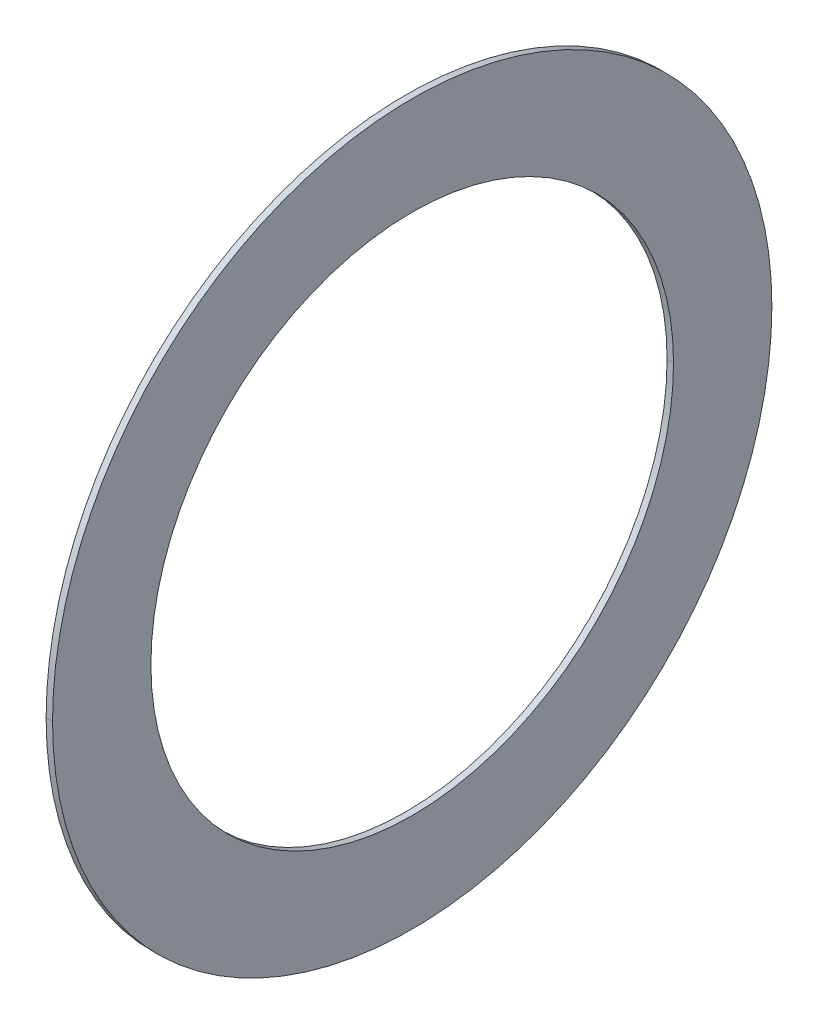
ISO-10303-21;
HEADER;
FILE_DESCRIPTION(('STEP AP214'),'2;1');
FILE_NAME('part.step','',(''),(''),'','','');
FILE_SCHEMA(('AUTOMOTIVE_DESIGN { 1 0 10303 214 1 1 1 1 }'));
ENDSEC;
DATA;
#1=APPLICATION_CONTEXT('core data for automotive mechanical design processes');
#2=APPLICATION_PROTOCOL_DEFINITION('international standard','automotive_design',2000,#1);
#3=PRODUCT_CONTEXT('',#1,'mechanical');
#4=PRODUCT('Part','Part','',(#3));
#5=PRODUCT_RELATED_PRODUCT_CATEGORY('part','',(#4));
#6=PRODUCT_DEFINITION_FORMATION('','',#4);
#7=PRODUCT_DEFINITION_CONTEXT('part definition',#1,'design');
#8=PRODUCT_DEFINITION('design','',#6,#7);
#9=PRODUCT_DEFINITION_SHAPE('','',#8);
#10=(LENGTH_UNIT() NAMED_UNIT(*) SI_UNIT(.MILLI.,.METRE.));
#11=(NAMED_UNIT(*) PLANE_ANGLE_UNIT() SI_UNIT($,.RADIAN.));
#12=(NAMED_UNIT(*) SI_UNIT($,.STERADIAN.) SOLID_ANGLE_UNIT());
#13=UNCERTAINTY_MEASURE_WITH_UNIT(LENGTH_MEASURE(1.E-05),#10,'distance_accuracy_value','');
#14=(GEOMETRIC_REPRESENTATION_CONTEXT(3) GLOBAL_UNCERTAINTY_ASSIGNED_CONTEXT((#13)) GLOBAL_UNIT_ASSIGNED_CONTEXT((#10,
#11,#12)) REPRESENTATION_CONTEXT('',''));
#15=CARTESIAN_POINT('',(0.,0.,0.));
#16=DIRECTION('',(0.,0.,1.));
#17=DIRECTION('',(1.,0.,0.));
#18=AXIS2_PLACEMENT_3D('',#15,#16,#17);
#19=CARTESIAN_POINT('',(0.,34.825,0.));
#20=DIRECTION('',(-1.,0.,0.));
#21=DIRECTION('',(0.,0.,1.));
#22=AXIS2_PLACEMENT_3D('',#19,#20,#21);
#23=PLANE('',#22);
#24=CARTESIAN_POINT('',(0.,0.,0.));
#25=DIRECTION('',(1.,0.,0.));
#26=DIRECTION('',(0.,0.,-1.));
#27=AXIS2_PLACEMENT_3D('',#24,#25,#26);
#28=CIRCLE('',#27,25.3);
#29=CARTESIAN_POINT('',(0.,0.,-25.3));
#30=VERTEX_POINT('',#29);
#31=CARTESIAN_POINT('',(0.,0.,25.3));
#32=VERTEX_POINT('',#31);
#33=EDGE_CURVE('E11',#30,#32,#28,.T.);
#34=ORIENTED_EDGE('',*,*,#33,.T.);
#35=CARTESIAN_POINT('',(0.,0.,0.));
#36=DIRECTION('',(1.,0.,0.));
#37=DIRECTION('',(0.,0.,-1.));
#38=AXIS2_PLACEMENT_3D('',#35,#36,#37);
#39=CIRCLE('',#38,25.3);
#40=EDGE_CURVE('E25',#32,#30,#39,.T.);
#41=ORIENTED_EDGE('',*,*,#40,.T.);
#42=EDGE_LOOP('',(#34,#41));
#43=FACE_BOUND('',#42,.T.);
#44=CARTESIAN_POINT('',(0.,0.,0.));
#45=DIRECTION('',(1.,0.,0.));
#46=DIRECTION('',(0.,0.,-1.));
#47=AXIS2_PLACEMENT_3D('',#44,#45,#46);
#48=CIRCLE('',#47,34.825);
#49=CARTESIAN_POINT('',(0.,0.,34.825));
#50=VERTEX_POINT('',#49);
#51=CARTESIAN_POINT('',(0.,0.,-34.825));
#52=VERTEX_POINT('',#51);
#53=EDGE_CURVE('E95',#50,#52,#48,.T.);
#54=ORIENTED_EDGE('',*,*,#53,.F.);
#55=CARTESIAN_POINT('',(0.,0.,0.));
#56=DIRECTION('',(1.,0.,0.));
#57=DIRECTION('',(0.,0.,-1.));
#58=AXIS2_PLACEMENT_3D('',#55,#56,#57);
#59=CIRCLE('',#58,34.825);
#60=EDGE_CURVE('E90',#52,#50,#59,.T.);
#61=ORIENTED_EDGE('',*,*,#60,.F.);
#62=EDGE_LOOP('',(#54,#61));
#63=FACE_BOUND('',#62,.T.);
#64=ADVANCED_FACE('F17',(#43,#63),#23,.T.);
#65=CARTESIAN_POINT('',(0.621,0.,0.));
#66=DIRECTION('',(1.,0.,0.));
#67=DIRECTION('',(0.,-1.,0.));
#68=AXIS2_PLACEMENT_3D('',#65,#66,#67);
#69=CYLINDRICAL_SURFACE('',#68,34.825);
#70=DIRECTION('',(1.,0.,0.));
#71=VECTOR('',#70,1.);
#72=CARTESIAN_POINT('',(0.,0.,34.825));
#73=LINE('',#72,#71);
#74=CARTESIAN_POINT('',(0.621,0.,34.825));
#75=VERTEX_POINT('',#74);
#76=EDGE_CURVE('E86',#50,#75,#73,.T.);
#77=ORIENTED_EDGE('',*,*,#76,.T.);
#78=CARTESIAN_POINT('',(0.621,0.,0.));
#79=DIRECTION('',(1.,0.,0.));
#80=DIRECTION('',(0.,0.,-1.));
#81=AXIS2_PLACEMENT_3D('',#78,#79,#80);
#82=CIRCLE('',#81,34.825);
#83=CARTESIAN_POINT('',(0.621,0.,-34.825));
#84=VERTEX_POINT('',#83);
#85=EDGE_CURVE('E81',#84,#75,#82,.T.);
#86=ORIENTED_EDGE('',*,*,#85,.F.);
#87=DIRECTION('',(1.,0.,0.));
#88=VECTOR('',#87,1.);
#89=CARTESIAN_POINT('',(0.,0.,-34.825));
#90=LINE('',#89,#88);
#91=EDGE_CURVE('E70',#52,#84,#90,.T.);
#92=ORIENTED_EDGE('',*,*,#91,.F.);
#93=ORIENTED_EDGE('',*,*,#60,.T.);
#94=EDGE_LOOP('',(#77,#86,#92,#93));
#95=FACE_BOUND('',#94,.T.);
#96=ADVANCED_FACE('F111',(#95),#69,.T.);
#97=CARTESIAN_POINT('',(0.621,0.,0.));
#98=DIRECTION('',(1.,0.,0.));
#99=DIRECTION('',(0.,1.,0.));
#100=AXIS2_PLACEMENT_3D('',#97,#98,#99);
#101=CYLINDRICAL_SURFACE('',#100,34.825);
#102=ORIENTED_EDGE('',*,*,#76,.F.);
#103=ORIENTED_EDGE('',*,*,#53,.T.);
#104=ORIENTED_EDGE('',*,*,#91,.T.);
#105=CARTESIAN_POINT('',(0.621,0.,0.));
#106=DIRECTION('',(1.,0.,0.));
#107=DIRECTION('',(0.,0.,-1.));
#108=AXIS2_PLACEMENT_3D('',#105,#106,#107);
#109=CIRCLE('',#108,34.825);
#110=EDGE_CURVE('E67',#75,#84,#109,.T.);
#111=ORIENTED_EDGE('',*,*,#110,.F.);
#112=EDGE_LOOP('',(#102,#103,#104,#111));
#113=FACE_BOUND('',#112,.T.);
#114=ADVANCED_FACE('F106',(#113),#101,.T.);
#115=CARTESIAN_POINT('',(0.621,25.3,0.));
#116=DIRECTION('',(1.,0.,0.));
#117=DIRECTION('',(0.,0.,-1.));
#118=AXIS2_PLACEMENT_3D('',#115,#116,#117);
#119=PLANE('',#118);
#120=ORIENTED_EDGE('',*,*,#85,.T.);
#121=ORIENTED_EDGE('',*,*,#110,.T.);
#122=EDGE_LOOP('',(#120,#121));
#123=FACE_BOUND('',#122,.T.);
#124=CARTESIAN_POINT('',(0.621,0.,0.));
#125=DIRECTION('',(1.,0.,0.));
#126=DIRECTION('',(0.,0.,-1.));
#127=AXIS2_PLACEMENT_3D('',#124,#125,#126);
#128=CIRCLE('',#127,25.3);
#129=CARTESIAN_POINT('',(0.621,0.,25.3));
#130=VERTEX_POINT('',#129);
#131=CARTESIAN_POINT('',(0.621,0.,-25.3));
#132=VERTEX_POINT('',#131);
#133=EDGE_CURVE('E55',#130,#132,#128,.T.);
#134=ORIENTED_EDGE('',*,*,#133,.F.);
#135=CARTESIAN_POINT('',(0.621,0.,0.));
#136=DIRECTION('',(1.,0.,0.));
#137=DIRECTION('',(0.,0.,-1.));
#138=AXIS2_PLACEMENT_3D('',#135,#136,#137);
#139=CIRCLE('',#138,25.3);
#140=EDGE_CURVE('E51',#132,#130,#139,.T.);
#141=ORIENTED_EDGE('',*,*,#140,.F.);
#142=EDGE_LOOP('',(#134,#141));
#143=FACE_BOUND('',#142,.T.);
#144=ADVANCED_FACE('F53',(#123,#143),#119,.T.);
#145=CARTESIAN_POINT('',(0.621,0.,0.));
#146=DIRECTION('',(1.,0.,0.));
#147=DIRECTION('',(0.,-1.,0.));
#148=AXIS2_PLACEMENT_3D('',#145,#146,#147);
#149=CYLINDRICAL_SURFACE('',#148,25.3);
#150=DIRECTION('',(1.,0.,0.));
#151=VECTOR('',#150,1.);
#152=CARTESIAN_POINT('',(0.,0.,25.3));
#153=LINE('',#152,#151);
#154=EDGE_CURVE('E59',#32,#130,#153,.T.);
#155=ORIENTED_EDGE('',*,*,#154,.F.);
#156=ORIENTED_EDGE('',*,*,#33,.F.);
#157=DIRECTION('',(1.,0.,0.));
#158=VECTOR('',#157,1.);
#159=CARTESIAN_POINT('',(0.,0.,-25.3));
#160=LINE('',#159,#158);
#161=EDGE_CURVE('E62',#30,#132,#160,.T.);
#162=ORIENTED_EDGE('',*,*,#161,.T.);
#163=ORIENTED_EDGE('',*,*,#140,.T.);
#164=EDGE_LOOP('',(#155,#156,#162,#163));
#165=FACE_BOUND('',#164,.T.);
#166=ADVANCED_FACE('F63',(#165),#149,.F.);
#167=CARTESIAN_POINT('',(0.621,0.,0.));
#168=DIRECTION('',(1.,0.,0.));
#169=DIRECTION('',(0.,1.,0.));
#170=AXIS2_PLACEMENT_3D('',#167,#168,#169);
#171=CYLINDRICAL_SURFACE('',#170,25.3);
#172=ORIENTED_EDGE('',*,*,#154,.T.);
#173=ORIENTED_EDGE('',*,*,#133,.T.);
#174=ORIENTED_EDGE('',*,*,#161,.F.);
#175=ORIENTED_EDGE('',*,*,#40,.F.);
#176=EDGE_LOOP('',(#172,#173,#174,#175));
#177=FACE_BOUND('',#176,.T.);
#178=ADVANCED_FACE('F66',(#177),#171,.F.);
#179=CLOSED_SHELL('',(#64,#96,#114,#144,#166,#178));
#180=MANIFOLD_SOLID_BREP('B1',#179);
#181=ADVANCED_BREP_SHAPE_REPRESENTATION('',(#18,#180),#14);
#182=SHAPE_DEFINITION_REPRESENTATION(#9,#181);
ENDSEC;
END-ISO-10303-21;
